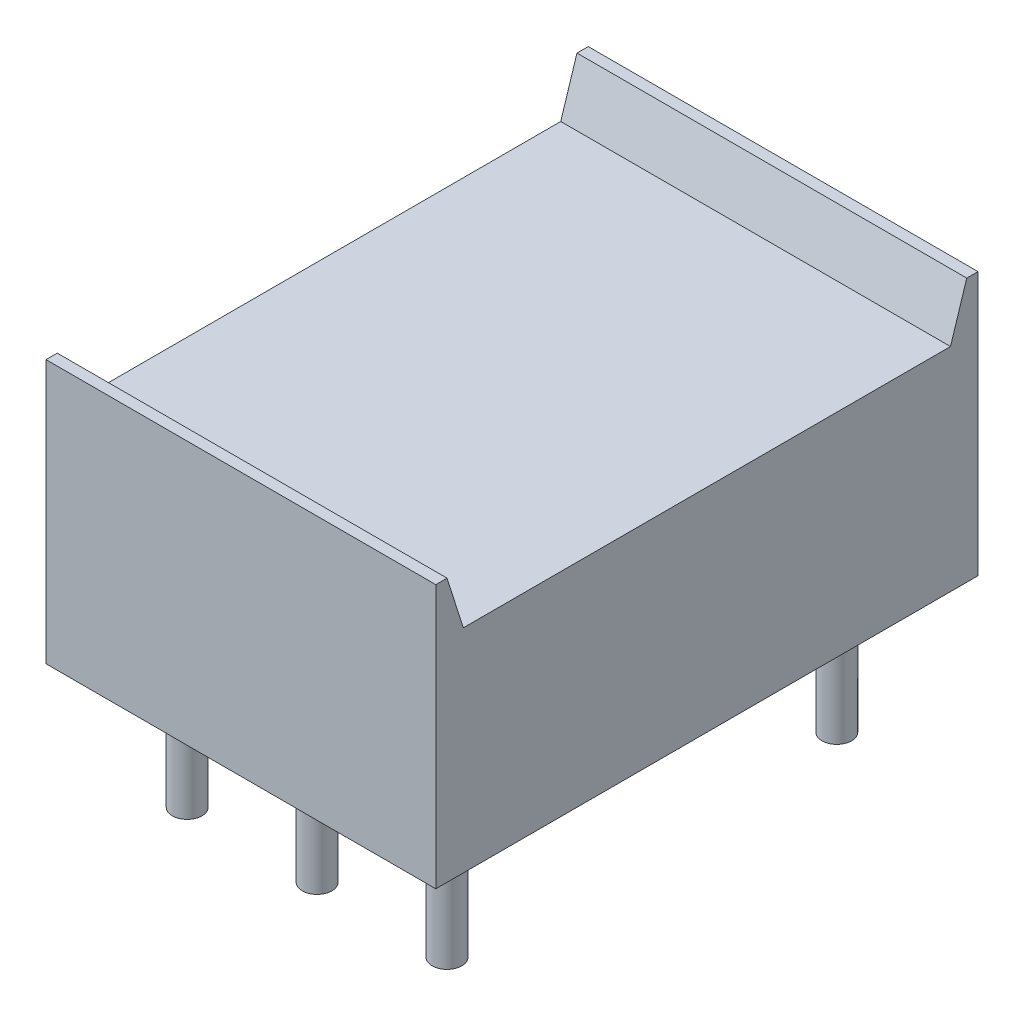
ISO-10303-21;
HEADER;
FILE_DESCRIPTION(('STEP AP214'),'2;1');
FILE_NAME('part.step','',(''),(''),'','','');
FILE_SCHEMA(('AUTOMOTIVE_DESIGN { 1 0 10303 214 1 1 1 1 }'));
ENDSEC;
DATA;
#1=APPLICATION_CONTEXT('core data for automotive mechanical design processes');
#2=APPLICATION_PROTOCOL_DEFINITION('international standard','automotive_design',2000,#1);
#3=PRODUCT_CONTEXT('',#1,'mechanical');
#4=PRODUCT('Part','Part','',(#3));
#5=PRODUCT_RELATED_PRODUCT_CATEGORY('part','',(#4));
#6=PRODUCT_DEFINITION_FORMATION('','',#4);
#7=PRODUCT_DEFINITION_CONTEXT('part definition',#1,'design');
#8=PRODUCT_DEFINITION('design','',#6,#7);
#9=PRODUCT_DEFINITION_SHAPE('','',#8);
#10=(LENGTH_UNIT() NAMED_UNIT(*) SI_UNIT(.MILLI.,.METRE.));
#11=(NAMED_UNIT(*) PLANE_ANGLE_UNIT() SI_UNIT($,.RADIAN.));
#12=(NAMED_UNIT(*) SI_UNIT($,.STERADIAN.) SOLID_ANGLE_UNIT());
#13=UNCERTAINTY_MEASURE_WITH_UNIT(LENGTH_MEASURE(1.E-05),#10,'distance_accuracy_value','');
#14=(GEOMETRIC_REPRESENTATION_CONTEXT(3) GLOBAL_UNCERTAINTY_ASSIGNED_CONTEXT((#13)) GLOBAL_UNIT_ASSIGNED_CONTEXT((#10,
#11,#12)) REPRESENTATION_CONTEXT('',''));
#15=CARTESIAN_POINT('',(0.,0.,0.));
#16=DIRECTION('',(0.,0.,1.));
#17=DIRECTION('',(1.,0.,0.));
#18=AXIS2_PLACEMENT_3D('',#15,#16,#17);
#19=CARTESIAN_POINT('',(3.81,5.15,-5.3));
#20=DIRECTION('',(0.,-1.,0.));
#21=DIRECTION('',(0.,0.,-1.));
#22=AXIS2_PLACEMENT_3D('',#19,#20,#21);
#23=PLANE('',#22);
#24=DIRECTION('',(0.,0.,-1.));
#25=VECTOR('',#24,1.);
#26=CARTESIAN_POINT('',(3.81,5.15,5.3));
#27=LINE('',#26,#25);
#28=CARTESIAN_POINT('',(3.81,5.15,5.3));
#29=VERTEX_POINT('',#28);
#30=CARTESIAN_POINT('',(3.81,5.15,5.08));
#31=VERTEX_POINT('',#30);
#32=EDGE_CURVE('E153',#29,#31,#27,.T.);
#33=ORIENTED_EDGE('',*,*,#32,.T.);
#34=DIRECTION('',(-1.,0.,0.));
#35=VECTOR('',#34,1.);
#36=CARTESIAN_POINT('',(3.81,5.15,5.08));
#37=LINE('',#36,#35);
#38=CARTESIAN_POINT('',(-3.81,5.15,5.08));
#39=VERTEX_POINT('',#38);
#40=EDGE_CURVE('E135',#31,#39,#37,.T.);
#41=ORIENTED_EDGE('',*,*,#40,.T.);
#42=DIRECTION('',(0.,0.,1.));
#43=VECTOR('',#42,1.);
#44=CARTESIAN_POINT('',(-3.81,5.15,5.3));
#45=LINE('',#44,#43);
#46=CARTESIAN_POINT('',(-3.81,5.15,5.3));
#47=VERTEX_POINT('',#46);
#48=EDGE_CURVE('E157',#39,#47,#45,.T.);
#49=ORIENTED_EDGE('',*,*,#48,.T.);
#50=DIRECTION('',(1.,0.,0.));
#51=VECTOR('',#50,1.);
#52=CARTESIAN_POINT('',(-3.81,5.15,5.3));
#53=LINE('',#52,#51);
#54=EDGE_CURVE('E57',#47,#29,#53,.T.);
#55=ORIENTED_EDGE('',*,*,#54,.T.);
#56=EDGE_LOOP('',(#33,#41,#49,#55));
#57=FACE_BOUND('',#56,.T.);
#58=ADVANCED_FACE('F33',(#57),#23,.F.);
#59=CARTESIAN_POINT('',(3.81,0.,-5.3));
#60=DIRECTION('',(0.,-1.,0.));
#61=DIRECTION('',(0.,0.,-1.));
#62=AXIS2_PLACEMENT_3D('',#59,#60,#61);
#63=PLANE('',#62);
#64=CARTESIAN_POINT('',(2.54,0.,-3.81));
#65=DIRECTION('',(0.,-1.,0.));
#66=DIRECTION('',(0.,0.,-1.));
#67=AXIS2_PLACEMENT_3D('',#64,#65,#66);
#68=CIRCLE('',#67,0.29);
#69=CARTESIAN_POINT('',(2.54,0.,-4.1));
#70=VERTEX_POINT('',#69);
#71=EDGE_CURVE('E146',#70,#70,#68,.T.);
#72=ORIENTED_EDGE('',*,*,#71,.F.);
#73=EDGE_LOOP('',(#72));
#74=FACE_BOUND('',#73,.T.);
#75=DIRECTION('',(0.,0.,-1.));
#76=VECTOR('',#75,1.);
#77=CARTESIAN_POINT('',(3.81,0.,5.3));
#78=LINE('',#77,#76);
#79=CARTESIAN_POINT('',(3.81,0.,5.3));
#80=VERTEX_POINT('',#79);
#81=CARTESIAN_POINT('',(3.81,0.,-5.3));
#82=VERTEX_POINT('',#81);
#83=EDGE_CURVE('E150',#80,#82,#78,.T.);
#84=ORIENTED_EDGE('',*,*,#83,.F.);
#85=DIRECTION('',(1.,0.,0.));
#86=VECTOR('',#85,1.);
#87=CARTESIAN_POINT('',(-3.81,0.,5.3));
#88=LINE('',#87,#86);
#89=CARTESIAN_POINT('',(-3.81,0.,5.3));
#90=VERTEX_POINT('',#89);
#91=EDGE_CURVE('E78',#90,#80,#88,.T.);
#92=ORIENTED_EDGE('',*,*,#91,.F.);
#93=DIRECTION('',(0.,0.,1.));
#94=VECTOR('',#93,1.);
#95=CARTESIAN_POINT('',(-3.81,0.,5.3));
#96=LINE('',#95,#94);
#97=CARTESIAN_POINT('',(-3.81,0.,-5.3));
#98=VERTEX_POINT('',#97);
#99=EDGE_CURVE('E167',#98,#90,#96,.T.);
#100=ORIENTED_EDGE('',*,*,#99,.F.);
#101=DIRECTION('',(-1.,0.,0.));
#102=VECTOR('',#101,1.);
#103=CARTESIAN_POINT('',(-3.81,0.,-5.3));
#104=LINE('',#103,#102);
#105=EDGE_CURVE('E165',#82,#98,#104,.T.);
#106=ORIENTED_EDGE('',*,*,#105,.F.);
#107=EDGE_LOOP('',(#84,#92,#100,#106));
#108=FACE_BOUND('',#107,.T.);
#109=CARTESIAN_POINT('',(0.,0.,-3.81));
#110=DIRECTION('',(0.,-1.,0.));
#111=DIRECTION('',(0.,0.,-1.));
#112=AXIS2_PLACEMENT_3D('',#109,#110,#111);
#113=CIRCLE('',#112,0.29);
#114=CARTESIAN_POINT('',(0.,0.,-4.1));
#115=VERTEX_POINT('',#114);
#116=EDGE_CURVE('E138',#115,#115,#113,.T.);
#117=ORIENTED_EDGE('',*,*,#116,.F.);
#118=EDGE_LOOP('',(#117));
#119=FACE_BOUND('',#118,.T.);
#120=CARTESIAN_POINT('',(-2.54,0.,-3.81));
#121=DIRECTION('',(0.,-1.,0.));
#122=DIRECTION('',(0.,0.,-1.));
#123=AXIS2_PLACEMENT_3D('',#120,#121,#122);
#124=CIRCLE('',#123,0.29);
#125=CARTESIAN_POINT('',(-2.54,0.,-4.1));
#126=VERTEX_POINT('',#125);
#127=EDGE_CURVE('E179',#126,#126,#124,.T.);
#128=ORIENTED_EDGE('',*,*,#127,.F.);
#129=EDGE_LOOP('',(#128));
#130=FACE_BOUND('',#129,.T.);
#131=CARTESIAN_POINT('',(2.54,0.,3.81));
#132=DIRECTION('',(0.,-1.,0.));
#133=DIRECTION('',(0.,0.,-1.));
#134=AXIS2_PLACEMENT_3D('',#131,#132,#133);
#135=CIRCLE('',#134,0.29);
#136=CARTESIAN_POINT('',(2.54,0.,3.52));
#137=VERTEX_POINT('',#136);
#138=EDGE_CURVE('E185',#137,#137,#135,.T.);
#139=ORIENTED_EDGE('',*,*,#138,.F.);
#140=EDGE_LOOP('',(#139));
#141=FACE_BOUND('',#140,.T.);
#142=CARTESIAN_POINT('',(0.,0.,3.81));
#143=DIRECTION('',(0.,-1.,0.));
#144=DIRECTION('',(0.,0.,-1.));
#145=AXIS2_PLACEMENT_3D('',#142,#143,#144);
#146=CIRCLE('',#145,0.29);
#147=CARTESIAN_POINT('',(0.,0.,3.52));
#148=VERTEX_POINT('',#147);
#149=EDGE_CURVE('E191',#148,#148,#146,.T.);
#150=ORIENTED_EDGE('',*,*,#149,.F.);
#151=EDGE_LOOP('',(#150));
#152=FACE_BOUND('',#151,.T.);
#153=CARTESIAN_POINT('',(-2.54,0.,3.81));
#154=DIRECTION('',(0.,-1.,0.));
#155=DIRECTION('',(0.,0.,-1.));
#156=AXIS2_PLACEMENT_3D('',#153,#154,#155);
#157=CIRCLE('',#156,0.29);
#158=CARTESIAN_POINT('',(-2.54,0.,3.52));
#159=VERTEX_POINT('',#158);
#160=EDGE_CURVE('E41',#159,#159,#157,.T.);
#161=ORIENTED_EDGE('',*,*,#160,.F.);
#162=EDGE_LOOP('',(#161));
#163=FACE_BOUND('',#162,.T.);
#164=ADVANCED_FACE('F201',(#74,#108,#119,#130,#141,#152,#163),#63,.T.);
#165=CARTESIAN_POINT('',(3.81,5.15,5.3));
#166=DIRECTION('',(-1.,0.,0.));
#167=DIRECTION('',(0.,0.,1.));
#168=AXIS2_PLACEMENT_3D('',#165,#166,#167);
#169=PLANE('',#168);
#170=DIRECTION('',(0.,0.,1.));
#171=VECTOR('',#170,1.);
#172=CARTESIAN_POINT('',(3.81,4.15,-4.7625));
#173=LINE('',#172,#171);
#174=CARTESIAN_POINT('',(3.81,4.15,-4.7625));
#175=VERTEX_POINT('',#174);
#176=CARTESIAN_POINT('',(3.81,4.15,4.7625));
#177=VERTEX_POINT('',#176);
#178=EDGE_CURVE('E118',#175,#177,#173,.T.);
#179=ORIENTED_EDGE('',*,*,#178,.T.);
#180=DIRECTION('',(0.,0.953113358842025,0.302613491432343));
#181=VECTOR('',#180,1.);
#182=CARTESIAN_POINT('',(3.81,4.15,4.7625));
#183=LINE('',#182,#181);
#184=EDGE_CURVE('E123',#177,#31,#183,.T.);
#185=ORIENTED_EDGE('',*,*,#184,.T.);
#186=ORIENTED_EDGE('',*,*,#32,.F.);
#187=DIRECTION('',(0.,-1.,0.));
#188=VECTOR('',#187,1.);
#189=CARTESIAN_POINT('',(3.81,5.15,5.3));
#190=LINE('',#189,#188);
#191=EDGE_CURVE('E162',#29,#80,#190,.T.);
#192=ORIENTED_EDGE('',*,*,#191,.T.);
#193=ORIENTED_EDGE('',*,*,#83,.T.);
#194=DIRECTION('',(0.,-1.,0.));
#195=VECTOR('',#194,1.);
#196=CARTESIAN_POINT('',(3.81,5.15,-5.3));
#197=LINE('',#196,#195);
#198=CARTESIAN_POINT('',(3.81,5.15,-5.3));
#199=VERTEX_POINT('',#198);
#200=EDGE_CURVE('E176',#199,#82,#197,.T.);
#201=ORIENTED_EDGE('',*,*,#200,.F.);
#202=CARTESIAN_POINT('',(3.81,5.15,-5.08));
#203=VERTEX_POINT('',#202);
#204=EDGE_CURVE('E85',#203,#199,#27,.T.);
#205=ORIENTED_EDGE('',*,*,#204,.F.);
#206=DIRECTION('',(0.,-0.953113358842025,0.302613491432343));
#207=VECTOR('',#206,1.);
#208=CARTESIAN_POINT('',(3.81,5.15,-5.08));
#209=LINE('',#208,#207);
#210=EDGE_CURVE('E48',#203,#175,#209,.T.);
#211=ORIENTED_EDGE('',*,*,#210,.T.);
#212=EDGE_LOOP('',(#179,#185,#186,#192,#193,#201,#205,#211));
#213=FACE_BOUND('',#212,.T.);
#214=ADVANCED_FACE('F125',(#213),#169,.F.);
#215=CARTESIAN_POINT('',(-3.81,5.15,-5.3));
#216=DIRECTION('',(0.,0.,1.));
#217=DIRECTION('',(1.,0.,0.));
#218=AXIS2_PLACEMENT_3D('',#215,#216,#217);
#219=PLANE('',#218);
#220=ORIENTED_EDGE('',*,*,#105,.T.);
#221=DIRECTION('',(0.,-1.,0.));
#222=VECTOR('',#221,1.);
#223=CARTESIAN_POINT('',(-3.81,5.15,-5.3));
#224=LINE('',#223,#222);
#225=CARTESIAN_POINT('',(-3.81,5.15,-5.3));
#226=VERTEX_POINT('',#225);
#227=EDGE_CURVE('E173',#226,#98,#224,.T.);
#228=ORIENTED_EDGE('',*,*,#227,.F.);
#229=DIRECTION('',(-1.,0.,0.));
#230=VECTOR('',#229,1.);
#231=CARTESIAN_POINT('',(-3.81,5.15,-5.3));
#232=LINE('',#231,#230);
#233=EDGE_CURVE('E155',#199,#226,#232,.T.);
#234=ORIENTED_EDGE('',*,*,#233,.F.);
#235=ORIENTED_EDGE('',*,*,#200,.T.);
#236=EDGE_LOOP('',(#220,#228,#234,#235));
#237=FACE_BOUND('',#236,.T.);
#238=ADVANCED_FACE('F209',(#237),#219,.F.);
#239=CARTESIAN_POINT('',(-3.81,5.15,5.3));
#240=DIRECTION('',(1.,0.,0.));
#241=DIRECTION('',(0.,0.,-1.));
#242=AXIS2_PLACEMENT_3D('',#239,#240,#241);
#243=PLANE('',#242);
#244=ORIENTED_EDGE('',*,*,#48,.F.);
#245=DIRECTION('',(0.,0.953113358842025,0.302613491432343));
#246=VECTOR('',#245,1.);
#247=CARTESIAN_POINT('',(-3.81,4.15,4.7625));
#248=LINE('',#247,#246);
#249=CARTESIAN_POINT('',(-3.81,4.15,4.7625));
#250=VERTEX_POINT('',#249);
#251=EDGE_CURVE('E127',#250,#39,#248,.T.);
#252=ORIENTED_EDGE('',*,*,#251,.F.);
#253=DIRECTION('',(0.,0.,1.));
#254=VECTOR('',#253,1.);
#255=CARTESIAN_POINT('',(-3.81,4.15,-4.7625));
#256=LINE('',#255,#254);
#257=CARTESIAN_POINT('',(-3.81,4.15,-4.7625));
#258=VERTEX_POINT('',#257);
#259=EDGE_CURVE('E129',#258,#250,#256,.T.);
#260=ORIENTED_EDGE('',*,*,#259,.F.);
#261=DIRECTION('',(0.,-0.953113358842025,0.302613491432343));
#262=VECTOR('',#261,1.);
#263=CARTESIAN_POINT('',(-3.81,5.15,-5.08));
#264=LINE('',#263,#262);
#265=CARTESIAN_POINT('',(-3.81,5.15,-5.08));
#266=VERTEX_POINT('',#265);
#267=EDGE_CURVE('E110',#266,#258,#264,.T.);
#268=ORIENTED_EDGE('',*,*,#267,.F.);
#269=EDGE_CURVE('E158',#226,#266,#45,.T.);
#270=ORIENTED_EDGE('',*,*,#269,.F.);
#271=ORIENTED_EDGE('',*,*,#227,.T.);
#272=ORIENTED_EDGE('',*,*,#99,.T.);
#273=DIRECTION('',(0.,-1.,0.));
#274=VECTOR('',#273,1.);
#275=CARTESIAN_POINT('',(-3.81,5.15,5.3));
#276=LINE('',#275,#274);
#277=EDGE_CURVE('E171',#47,#90,#276,.T.);
#278=ORIENTED_EDGE('',*,*,#277,.F.);
#279=EDGE_LOOP('',(#244,#252,#260,#268,#270,#271,#272,#278));
#280=FACE_BOUND('',#279,.T.);
#281=ADVANCED_FACE('F220',(#280),#243,.F.);
#282=CARTESIAN_POINT('',(-3.81,5.15,5.3));
#283=DIRECTION('',(0.,0.,-1.));
#284=DIRECTION('',(-1.,0.,0.));
#285=AXIS2_PLACEMENT_3D('',#282,#283,#284);
#286=PLANE('',#285);
#287=ORIENTED_EDGE('',*,*,#91,.T.);
#288=ORIENTED_EDGE('',*,*,#191,.F.);
#289=ORIENTED_EDGE('',*,*,#54,.F.);
#290=ORIENTED_EDGE('',*,*,#277,.T.);
#291=EDGE_LOOP('',(#287,#288,#289,#290));
#292=FACE_BOUND('',#291,.T.);
#293=ADVANCED_FACE('F217',(#292),#286,.F.);
#294=ORIENTED_EDGE('',*,*,#269,.T.);
#295=DIRECTION('',(-1.,0.,0.));
#296=VECTOR('',#295,1.);
#297=CARTESIAN_POINT('',(3.81,5.15,-5.08));
#298=LINE('',#297,#296);
#299=EDGE_CURVE('E115',#203,#266,#298,.T.);
#300=ORIENTED_EDGE('',*,*,#299,.F.);
#301=ORIENTED_EDGE('',*,*,#204,.T.);
#302=ORIENTED_EDGE('',*,*,#233,.T.);
#303=EDGE_LOOP('',(#294,#300,#301,#302));
#304=FACE_BOUND('',#303,.T.);
#305=ADVANCED_FACE('F212',(#304),#23,.F.);
#306=CARTESIAN_POINT('',(2.54,-2.54,-3.81));
#307=DIRECTION('',(0.,1.,0.));
#308=DIRECTION('',(0.,0.,1.));
#309=AXIS2_PLACEMENT_3D('',#306,#307,#308);
#310=CYLINDRICAL_SURFACE('',#309,0.29);
#311=CARTESIAN_POINT('',(2.54,-2.54,-3.81));
#312=DIRECTION('',(0.,-1.,0.));
#313=DIRECTION('',(0.,0.,-1.));
#314=AXIS2_PLACEMENT_3D('',#311,#312,#313);
#315=CIRCLE('',#314,0.29);
#316=CARTESIAN_POINT('',(2.54,-2.54,-4.1));
#317=VERTEX_POINT('',#316);
#318=EDGE_CURVE('E147',#317,#317,#315,.T.);
#319=ORIENTED_EDGE('',*,*,#318,.F.);
#320=EDGE_LOOP('',(#319));
#321=FACE_BOUND('',#320,.T.);
#322=ORIENTED_EDGE('',*,*,#71,.T.);
#323=EDGE_LOOP('',(#322));
#324=FACE_BOUND('',#323,.T.);
#325=ADVANCED_FACE('F310',(#321,#324),#310,.T.);
#326=CARTESIAN_POINT('',(2.54,-2.54,-3.81));
#327=DIRECTION('',(0.,-1.,0.));
#328=DIRECTION('',(0.,0.,-1.));
#329=AXIS2_PLACEMENT_3D('',#326,#327,#328);
#330=PLANE('',#329);
#331=ORIENTED_EDGE('',*,*,#318,.T.);
#332=EDGE_LOOP('',(#331));
#333=FACE_BOUND('',#332,.T.);
#334=ADVANCED_FACE('F302',(#333),#330,.T.);
#335=CARTESIAN_POINT('',(0.,-2.54,-3.81));
#336=DIRECTION('',(0.,1.,0.));
#337=DIRECTION('',(0.,0.,1.));
#338=AXIS2_PLACEMENT_3D('',#335,#336,#337);
#339=CYLINDRICAL_SURFACE('',#338,0.29);
#340=CARTESIAN_POINT('',(0.,-2.54,-3.81));
#341=DIRECTION('',(0.,-1.,0.));
#342=DIRECTION('',(0.,0.,-1.));
#343=AXIS2_PLACEMENT_3D('',#340,#341,#342);
#344=CIRCLE('',#343,0.29);
#345=CARTESIAN_POINT('',(0.,-2.54,-4.1));
#346=VERTEX_POINT('',#345);
#347=EDGE_CURVE('E143',#346,#346,#344,.T.);
#348=ORIENTED_EDGE('',*,*,#347,.F.);
#349=EDGE_LOOP('',(#348));
#350=FACE_BOUND('',#349,.T.);
#351=ORIENTED_EDGE('',*,*,#116,.T.);
#352=EDGE_LOOP('',(#351));
#353=FACE_BOUND('',#352,.T.);
#354=ADVANCED_FACE('F294',(#350,#353),#339,.T.);
#355=CARTESIAN_POINT('',(0.,-2.54,-3.81));
#356=DIRECTION('',(0.,-1.,0.));
#357=DIRECTION('',(0.,0.,-1.));
#358=AXIS2_PLACEMENT_3D('',#355,#356,#357);
#359=PLANE('',#358);
#360=ORIENTED_EDGE('',*,*,#347,.T.);
#361=EDGE_LOOP('',(#360));
#362=FACE_BOUND('',#361,.T.);
#363=ADVANCED_FACE('F235',(#362),#359,.T.);
#364=CARTESIAN_POINT('',(-2.54,-2.54,-3.81));
#365=DIRECTION('',(0.,-1.,0.));
#366=DIRECTION('',(0.,0.,-1.));
#367=AXIS2_PLACEMENT_3D('',#364,#365,#366);
#368=PLANE('',#367);
#369=CARTESIAN_POINT('',(-2.54,-2.54,-3.81));
#370=DIRECTION('',(0.,-1.,0.));
#371=DIRECTION('',(0.,0.,-1.));
#372=AXIS2_PLACEMENT_3D('',#369,#370,#371);
#373=CIRCLE('',#372,0.29);
#374=CARTESIAN_POINT('',(-2.54,-2.54,-4.1));
#375=VERTEX_POINT('',#374);
#376=EDGE_CURVE('E182',#375,#375,#373,.T.);
#377=ORIENTED_EDGE('',*,*,#376,.T.);
#378=EDGE_LOOP('',(#377));
#379=FACE_BOUND('',#378,.T.);
#380=ADVANCED_FACE('F231',(#379),#368,.T.);
#381=CARTESIAN_POINT('',(-2.54,-2.54,-3.81));
#382=DIRECTION('',(0.,1.,0.));
#383=DIRECTION('',(0.,0.,1.));
#384=AXIS2_PLACEMENT_3D('',#381,#382,#383);
#385=CYLINDRICAL_SURFACE('',#384,0.29);
#386=ORIENTED_EDGE('',*,*,#376,.F.);
#387=EDGE_LOOP('',(#386));
#388=FACE_BOUND('',#387,.T.);
#389=ORIENTED_EDGE('',*,*,#127,.T.);
#390=EDGE_LOOP('',(#389));
#391=FACE_BOUND('',#390,.T.);
#392=ADVANCED_FACE('F227',(#388,#391),#385,.T.);
#393=CARTESIAN_POINT('',(2.54,-2.54,3.81));
#394=DIRECTION('',(0.,-1.,0.));
#395=DIRECTION('',(0.,0.,-1.));
#396=AXIS2_PLACEMENT_3D('',#393,#394,#395);
#397=PLANE('',#396);
#398=CARTESIAN_POINT('',(2.54,-2.54,3.81));
#399=DIRECTION('',(0.,-1.,0.));
#400=DIRECTION('',(0.,0.,-1.));
#401=AXIS2_PLACEMENT_3D('',#398,#399,#400);
#402=CIRCLE('',#401,0.29);
#403=CARTESIAN_POINT('',(2.54,-2.54,3.52));
#404=VERTEX_POINT('',#403);
#405=EDGE_CURVE('E188',#404,#404,#402,.T.);
#406=ORIENTED_EDGE('',*,*,#405,.T.);
#407=EDGE_LOOP('',(#406));
#408=FACE_BOUND('',#407,.T.);
#409=ADVANCED_FACE('F230',(#408),#397,.T.);
#410=CARTESIAN_POINT('',(2.54,-2.54,3.81));
#411=DIRECTION('',(0.,1.,0.));
#412=DIRECTION('',(0.,0.,1.));
#413=AXIS2_PLACEMENT_3D('',#410,#411,#412);
#414=CYLINDRICAL_SURFACE('',#413,0.29);
#415=ORIENTED_EDGE('',*,*,#405,.F.);
#416=EDGE_LOOP('',(#415));
#417=FACE_BOUND('',#416,.T.);
#418=ORIENTED_EDGE('',*,*,#138,.T.);
#419=EDGE_LOOP('',(#418));
#420=FACE_BOUND('',#419,.T.);
#421=ADVANCED_FACE('F237',(#417,#420),#414,.T.);
#422=CARTESIAN_POINT('',(0.,-2.54,3.81));
#423=DIRECTION('',(0.,-1.,0.));
#424=DIRECTION('',(0.,0.,-1.));
#425=AXIS2_PLACEMENT_3D('',#422,#423,#424);
#426=PLANE('',#425);
#427=CARTESIAN_POINT('',(0.,-2.54,3.81));
#428=DIRECTION('',(0.,-1.,0.));
#429=DIRECTION('',(0.,0.,-1.));
#430=AXIS2_PLACEMENT_3D('',#427,#428,#429);
#431=CIRCLE('',#430,0.29);
#432=CARTESIAN_POINT('',(0.,-2.54,3.52));
#433=VERTEX_POINT('',#432);
#434=EDGE_CURVE('E194',#433,#433,#431,.T.);
#435=ORIENTED_EDGE('',*,*,#434,.T.);
#436=EDGE_LOOP('',(#435));
#437=FACE_BOUND('',#436,.T.);
#438=ADVANCED_FACE('F240',(#437),#426,.T.);
#439=CARTESIAN_POINT('',(0.,-2.54,3.81));
#440=DIRECTION('',(0.,1.,0.));
#441=DIRECTION('',(0.,0.,1.));
#442=AXIS2_PLACEMENT_3D('',#439,#440,#441);
#443=CYLINDRICAL_SURFACE('',#442,0.29);
#444=ORIENTED_EDGE('',*,*,#434,.F.);
#445=EDGE_LOOP('',(#444));
#446=FACE_BOUND('',#445,.T.);
#447=ORIENTED_EDGE('',*,*,#149,.T.);
#448=EDGE_LOOP('',(#447));
#449=FACE_BOUND('',#448,.T.);
#450=ADVANCED_FACE('F245',(#446,#449),#443,.T.);
#451=CARTESIAN_POINT('',(-2.54,-2.54,3.81));
#452=DIRECTION('',(0.,-1.,0.));
#453=DIRECTION('',(0.,0.,-1.));
#454=AXIS2_PLACEMENT_3D('',#451,#452,#453);
#455=PLANE('',#454);
#456=CARTESIAN_POINT('',(-2.54,-2.54,3.81));
#457=DIRECTION('',(0.,-1.,0.));
#458=DIRECTION('',(0.,0.,-1.));
#459=AXIS2_PLACEMENT_3D('',#456,#457,#458);
#460=CIRCLE('',#459,0.29);
#461=CARTESIAN_POINT('',(-2.54,-2.54,3.52));
#462=VERTEX_POINT('',#461);
#463=EDGE_CURVE('E11',#462,#462,#460,.T.);
#464=ORIENTED_EDGE('',*,*,#463,.T.);
#465=EDGE_LOOP('',(#464));
#466=FACE_BOUND('',#465,.T.);
#467=ADVANCED_FACE('F35',(#466),#455,.T.);
#468=CARTESIAN_POINT('',(-2.54,-2.54,3.81));
#469=DIRECTION('',(0.,1.,0.));
#470=DIRECTION('',(0.,0.,1.));
#471=AXIS2_PLACEMENT_3D('',#468,#469,#470);
#472=CYLINDRICAL_SURFACE('',#471,0.29);
#473=ORIENTED_EDGE('',*,*,#463,.F.);
#474=EDGE_LOOP('',(#473));
#475=FACE_BOUND('',#474,.T.);
#476=ORIENTED_EDGE('',*,*,#160,.T.);
#477=EDGE_LOOP('',(#476));
#478=FACE_BOUND('',#477,.T.);
#479=ADVANCED_FACE('F199',(#475,#478),#472,.T.);
#480=CARTESIAN_POINT('',(3.81,4.15,4.7625));
#481=DIRECTION('',(0.,-0.302613491432343,0.953113358842025));
#482=DIRECTION('',(0.,-0.953113358842025,-0.302613491432343));
#483=AXIS2_PLACEMENT_3D('',#480,#481,#482);
#484=PLANE('',#483);
#485=ORIENTED_EDGE('',*,*,#251,.T.);
#486=ORIENTED_EDGE('',*,*,#40,.F.);
#487=ORIENTED_EDGE('',*,*,#184,.F.);
#488=DIRECTION('',(-1.,0.,0.));
#489=VECTOR('',#488,1.);
#490=CARTESIAN_POINT('',(3.81,4.15,4.7625));
#491=LINE('',#490,#489);
#492=EDGE_CURVE('E114',#177,#250,#491,.T.);
#493=ORIENTED_EDGE('',*,*,#492,.T.);
#494=EDGE_LOOP('',(#485,#486,#487,#493));
#495=FACE_BOUND('',#494,.T.);
#496=ADVANCED_FACE('F252',(#495),#484,.F.);
#497=CARTESIAN_POINT('',(3.81,4.15,-4.7625));
#498=DIRECTION('',(0.,-1.,0.));
#499=DIRECTION('',(0.,0.,-1.));
#500=AXIS2_PLACEMENT_3D('',#497,#498,#499);
#501=PLANE('',#500);
#502=ORIENTED_EDGE('',*,*,#259,.T.);
#503=ORIENTED_EDGE('',*,*,#492,.F.);
#504=ORIENTED_EDGE('',*,*,#178,.F.);
#505=DIRECTION('',(-1.,0.,0.));
#506=VECTOR('',#505,1.);
#507=CARTESIAN_POINT('',(3.81,4.15,-4.7625));
#508=LINE('',#507,#506);
#509=EDGE_CURVE('E106',#175,#258,#508,.T.);
#510=ORIENTED_EDGE('',*,*,#509,.T.);
#511=EDGE_LOOP('',(#502,#503,#504,#510));
#512=FACE_BOUND('',#511,.T.);
#513=ADVANCED_FACE('F119',(#512),#501,.F.);
#514=CARTESIAN_POINT('',(3.81,5.15,-5.08));
#515=DIRECTION('',(0.,-0.302613491432343,-0.953113358842025));
#516=DIRECTION('',(0.,0.953113358842025,-0.302613491432343));
#517=AXIS2_PLACEMENT_3D('',#514,#515,#516);
#518=PLANE('',#517);
#519=ORIENTED_EDGE('',*,*,#267,.T.);
#520=ORIENTED_EDGE('',*,*,#509,.F.);
#521=ORIENTED_EDGE('',*,*,#210,.F.);
#522=ORIENTED_EDGE('',*,*,#299,.T.);
#523=EDGE_LOOP('',(#519,#520,#521,#522));
#524=FACE_BOUND('',#523,.T.);
#525=ADVANCED_FACE('F108',(#524),#518,.F.);
#526=CLOSED_SHELL('',(#58,#164,#214,#238,#281,#293,#305,#325,#334,#354,#363,#380,#392,#409,#421,
#438,#450,#467,#479,#496,#513,#525));
#527=MANIFOLD_SOLID_BREP('B2',#526);
#528=ADVANCED_BREP_SHAPE_REPRESENTATION('',(#18,#527),#14);
#529=SHAPE_DEFINITION_REPRESENTATION(#9,#528);
ENDSEC;
END-ISO-10303-21;
